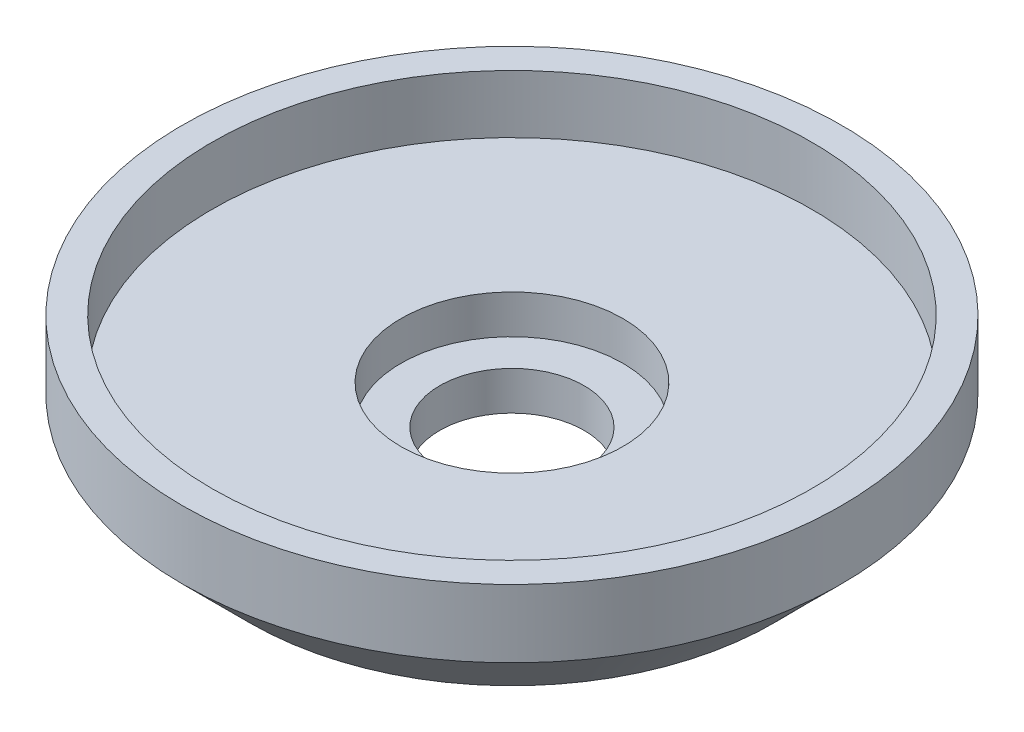
ISO-10303-21;
HEADER;
FILE_DESCRIPTION(('STEP AP214'),'2;1');
FILE_NAME('part.step','',(''),(''),'','','');
FILE_SCHEMA(('AUTOMOTIVE_DESIGN { 1 0 10303 214 1 1 1 1 }'));
ENDSEC;
DATA;
#1=APPLICATION_CONTEXT('core data for automotive mechanical design processes');
#2=APPLICATION_PROTOCOL_DEFINITION('international standard','automotive_design',2000,#1);
#3=PRODUCT_CONTEXT('',#1,'mechanical');
#4=PRODUCT('Part','Part','',(#3));
#5=PRODUCT_RELATED_PRODUCT_CATEGORY('part','',(#4));
#6=PRODUCT_DEFINITION_FORMATION('','',#4);
#7=PRODUCT_DEFINITION_CONTEXT('part definition',#1,'design');
#8=PRODUCT_DEFINITION('design','',#6,#7);
#9=PRODUCT_DEFINITION_SHAPE('','',#8);
#10=(LENGTH_UNIT() NAMED_UNIT(*) SI_UNIT(.MILLI.,.METRE.));
#11=(NAMED_UNIT(*) PLANE_ANGLE_UNIT() SI_UNIT($,.RADIAN.));
#12=(NAMED_UNIT(*) SI_UNIT($,.STERADIAN.) SOLID_ANGLE_UNIT());
#13=UNCERTAINTY_MEASURE_WITH_UNIT(LENGTH_MEASURE(1.E-05),#10,'distance_accuracy_value','');
#14=(GEOMETRIC_REPRESENTATION_CONTEXT(3) GLOBAL_UNCERTAINTY_ASSIGNED_CONTEXT((#13)) GLOBAL_UNIT_ASSIGNED_CONTEXT((#10,
#11,#12)) REPRESENTATION_CONTEXT('',''));
#15=CARTESIAN_POINT('',(0.,0.,0.));
#16=DIRECTION('',(0.,0.,1.));
#17=DIRECTION('',(1.,0.,0.));
#18=AXIS2_PLACEMENT_3D('',#15,#16,#17);
#19=CARTESIAN_POINT('',(0.,14.,0.));
#20=DIRECTION('',(0.,-1.,0.));
#21=DIRECTION('',(0.,0.,-1.));
#22=AXIS2_PLACEMENT_3D('',#19,#20,#21);
#23=CYLINDRICAL_SURFACE('',#22,34.);
#24=CARTESIAN_POINT('',(0.,7.00000000000001,0.));
#25=DIRECTION('',(0.,1.,0.));
#26=DIRECTION('',(0.,0.,1.));
#27=AXIS2_PLACEMENT_3D('',#24,#25,#26);
#28=CIRCLE('',#27,34.);
#29=CARTESIAN_POINT('',(0.,7.00000000000001,34.));
#30=VERTEX_POINT('',#29);
#31=EDGE_CURVE('E49',#30,#30,#28,.T.);
#32=ORIENTED_EDGE('',*,*,#31,.T.);
#33=EDGE_LOOP('',(#32));
#34=FACE_BOUND('',#33,.T.);
#35=CARTESIAN_POINT('',(0.,14.,0.));
#36=DIRECTION('',(0.,1.,0.));
#37=DIRECTION('',(0.,0.,1.));
#38=AXIS2_PLACEMENT_3D('',#35,#36,#37);
#39=CIRCLE('',#38,34.);
#40=CARTESIAN_POINT('',(0.,14.,34.));
#41=VERTEX_POINT('',#40);
#42=EDGE_CURVE('E53',#41,#41,#39,.T.);
#43=ORIENTED_EDGE('',*,*,#42,.F.);
#44=EDGE_LOOP('',(#43));
#45=FACE_BOUND('',#44,.T.);
#46=ADVANCED_FACE('F41',(#34,#45),#23,.T.);
#47=CARTESIAN_POINT('',(0.,14.,0.));
#48=DIRECTION('',(0.,1.,0.));
#49=DIRECTION('',(0.,0.,1.));
#50=AXIS2_PLACEMENT_3D('',#47,#48,#49);
#51=PLANE('',#50);
#52=CARTESIAN_POINT('',(0.,14.,0.));
#53=DIRECTION('',(0.,1.,0.));
#54=DIRECTION('',(0.,0.,1.));
#55=AXIS2_PLACEMENT_3D('',#52,#53,#54);
#56=CIRCLE('',#55,30.95);
#57=CARTESIAN_POINT('',(0.,14.,30.95));
#58=VERTEX_POINT('',#57);
#59=EDGE_CURVE('E60',#58,#58,#56,.T.);
#60=ORIENTED_EDGE('',*,*,#59,.F.);
#61=EDGE_LOOP('',(#60));
#62=FACE_BOUND('',#61,.T.);
#63=ORIENTED_EDGE('',*,*,#42,.T.);
#64=EDGE_LOOP('',(#63));
#65=FACE_BOUND('',#64,.T.);
#66=ADVANCED_FACE('F110',(#62,#65),#51,.T.);
#67=CARTESIAN_POINT('',(0.,0.,0.));
#68=DIRECTION('',(0.,1.,0.));
#69=DIRECTION('',(0.,0.,1.));
#70=AXIS2_PLACEMENT_3D('',#67,#68,#69);
#71=PLANE('',#70);
#72=CARTESIAN_POINT('',(0.,0.,0.));
#73=DIRECTION('',(0.,1.,0.));
#74=DIRECTION('',(0.,0.,1.));
#75=AXIS2_PLACEMENT_3D('',#72,#73,#74);
#76=CIRCLE('',#75,27.);
#77=CARTESIAN_POINT('',(0.,0.,27.));
#78=VERTEX_POINT('',#77);
#79=EDGE_CURVE('E10',#78,#78,#76,.F.);
#80=ORIENTED_EDGE('',*,*,#79,.T.);
#81=EDGE_LOOP('',(#80));
#82=FACE_BOUND('',#81,.T.);
#83=CARTESIAN_POINT('',(0.,0.,0.));
#84=DIRECTION('',(0.,1.,0.));
#85=DIRECTION('',(0.,0.,1.));
#86=AXIS2_PLACEMENT_3D('',#83,#84,#85);
#87=CIRCLE('',#86,7.45);
#88=CARTESIAN_POINT('',(0.,0.,7.45));
#89=VERTEX_POINT('',#88);
#90=EDGE_CURVE('E69',#89,#89,#87,.T.);
#91=ORIENTED_EDGE('',*,*,#90,.T.);
#92=EDGE_LOOP('',(#91));
#93=FACE_BOUND('',#92,.T.);
#94=ADVANCED_FACE('F78',(#82,#93),#71,.F.);
#95=CARTESIAN_POINT('',(0.,8.,0.));
#96=DIRECTION('',(0.,1.,0.));
#97=DIRECTION('',(0.,0.,1.));
#98=AXIS2_PLACEMENT_3D('',#95,#96,#97);
#99=CYLINDRICAL_SURFACE('',#98,30.95);
#100=CARTESIAN_POINT('',(0.,8.,0.));
#101=DIRECTION('',(0.,1.,0.));
#102=DIRECTION('',(0.,0.,1.));
#103=AXIS2_PLACEMENT_3D('',#100,#101,#102);
#104=CIRCLE('',#103,30.95);
#105=CARTESIAN_POINT('',(0.,8.,30.95));
#106=VERTEX_POINT('',#105);
#107=EDGE_CURVE('E57',#106,#106,#104,.T.);
#108=ORIENTED_EDGE('',*,*,#107,.F.);
#109=EDGE_LOOP('',(#108));
#110=FACE_BOUND('',#109,.T.);
#111=ORIENTED_EDGE('',*,*,#59,.T.);
#112=EDGE_LOOP('',(#111));
#113=FACE_BOUND('',#112,.T.);
#114=ADVANCED_FACE('F101',(#110,#113),#99,.F.);
#115=CARTESIAN_POINT('',(0.,8.,0.));
#116=DIRECTION('',(0.,1.,0.));
#117=DIRECTION('',(0.,0.,1.));
#118=AXIS2_PLACEMENT_3D('',#115,#116,#117);
#119=PLANE('',#118);
#120=CARTESIAN_POINT('',(0.,8.,0.));
#121=DIRECTION('',(0.,1.,0.));
#122=DIRECTION('',(0.,0.,1.));
#123=AXIS2_PLACEMENT_3D('',#120,#121,#122);
#124=CIRCLE('',#123,11.45);
#125=CARTESIAN_POINT('',(0.,8.,11.45));
#126=VERTEX_POINT('',#125);
#127=EDGE_CURVE('E66',#126,#126,#124,.T.);
#128=ORIENTED_EDGE('',*,*,#127,.F.);
#129=EDGE_LOOP('',(#128));
#130=FACE_BOUND('',#129,.T.);
#131=ORIENTED_EDGE('',*,*,#107,.T.);
#132=EDGE_LOOP('',(#131));
#133=FACE_BOUND('',#132,.T.);
#134=ADVANCED_FACE('F95',(#130,#133),#119,.T.);
#135=CARTESIAN_POINT('',(0.,4.,0.));
#136=DIRECTION('',(0.,1.,0.));
#137=DIRECTION('',(0.,0.,1.));
#138=AXIS2_PLACEMENT_3D('',#135,#136,#137);
#139=CYLINDRICAL_SURFACE('',#138,11.45);
#140=CARTESIAN_POINT('',(0.,4.,0.));
#141=DIRECTION('',(0.,1.,0.));
#142=DIRECTION('',(0.,0.,1.));
#143=AXIS2_PLACEMENT_3D('',#140,#141,#142);
#144=CIRCLE('',#143,11.45);
#145=CARTESIAN_POINT('',(0.,4.,11.45));
#146=VERTEX_POINT('',#145);
#147=EDGE_CURVE('E63',#146,#146,#144,.T.);
#148=ORIENTED_EDGE('',*,*,#147,.F.);
#149=EDGE_LOOP('',(#148));
#150=FACE_BOUND('',#149,.T.);
#151=ORIENTED_EDGE('',*,*,#127,.T.);
#152=EDGE_LOOP('',(#151));
#153=FACE_BOUND('',#152,.T.);
#154=ADVANCED_FACE('F89',(#150,#153),#139,.F.);
#155=CARTESIAN_POINT('',(0.,4.,0.));
#156=DIRECTION('',(0.,1.,0.));
#157=DIRECTION('',(0.,0.,1.));
#158=AXIS2_PLACEMENT_3D('',#155,#156,#157);
#159=PLANE('',#158);
#160=CARTESIAN_POINT('',(0.,4.,0.));
#161=DIRECTION('',(0.,1.,0.));
#162=DIRECTION('',(0.,0.,1.));
#163=AXIS2_PLACEMENT_3D('',#160,#161,#162);
#164=CIRCLE('',#163,7.45);
#165=CARTESIAN_POINT('',(0.,4.,7.45));
#166=VERTEX_POINT('',#165);
#167=EDGE_CURVE('E72',#166,#166,#164,.T.);
#168=ORIENTED_EDGE('',*,*,#167,.F.);
#169=EDGE_LOOP('',(#168));
#170=FACE_BOUND('',#169,.T.);
#171=ORIENTED_EDGE('',*,*,#147,.T.);
#172=EDGE_LOOP('',(#171));
#173=FACE_BOUND('',#172,.T.);
#174=ADVANCED_FACE('F83',(#170,#173),#159,.T.);
#175=CARTESIAN_POINT('',(0.,0.,0.));
#176=DIRECTION('',(0.,1.,0.));
#177=DIRECTION('',(0.,0.,1.));
#178=AXIS2_PLACEMENT_3D('',#175,#176,#177);
#179=CYLINDRICAL_SURFACE('',#178,7.45);
#180=ORIENTED_EDGE('',*,*,#90,.F.);
#181=EDGE_LOOP('',(#180));
#182=FACE_BOUND('',#181,.T.);
#183=ORIENTED_EDGE('',*,*,#167,.T.);
#184=EDGE_LOOP('',(#183));
#185=FACE_BOUND('',#184,.T.);
#186=ADVANCED_FACE('F80',(#182,#185),#179,.F.);
#187=CARTESIAN_POINT('',(0.,7.00000000000001,0.));
#188=DIRECTION('',(0.,1.,0.));
#189=DIRECTION('',(0.,0.,1.));
#190=AXIS2_PLACEMENT_3D('',#187,#188,#189);
#191=CONICAL_SURFACE('',#190,34.,0.78539816339745);
#192=CARTESIAN_POINT('',(0.,0.,27.));
#193=CARTESIAN_POINT('',(0.,0.0729166666666658,27.0729166666666));
#194=CARTESIAN_POINT('',(0.,0.145833333333333,27.1458333333333));
#195=CARTESIAN_POINT('',(0.,0.291666666666666,27.2916666666666));
#196=CARTESIAN_POINT('',(0.,0.364583333333333,27.3645833333333));
#197=CARTESIAN_POINT('',(0.,0.510416666666666,27.5104166666666));
#198=CARTESIAN_POINT('',(0.,0.583333333333333,27.5833333333333));
#199=CARTESIAN_POINT('',(0.,0.729166666666667,27.7291666666666));
#200=CARTESIAN_POINT('',(0.,0.802083333333334,27.8020833333333));
#201=CARTESIAN_POINT('',(0.,0.947916666666667,27.9479166666666));
#202=CARTESIAN_POINT('',(0.,1.02083333333333,28.0208333333333));
#203=CARTESIAN_POINT('',(0.,1.16666666666667,28.1666666666666));
#204=CARTESIAN_POINT('',(0.,1.23958333333333,28.2395833333333));
#205=CARTESIAN_POINT('',(0.,1.38541666666667,28.3854166666666));
#206=CARTESIAN_POINT('',(0.,1.45833333333333,28.4583333333333));
#207=CARTESIAN_POINT('',(0.,1.60416666666667,28.6041666666666));
#208=CARTESIAN_POINT('',(0.,1.67708333333333,28.6770833333333));
#209=CARTESIAN_POINT('',(0.,1.82291666666667,28.8229166666666));
#210=CARTESIAN_POINT('',(0.,1.89583333333333,28.8958333333333));
#211=CARTESIAN_POINT('',(0.,2.04166666666667,29.0416666666666));
#212=CARTESIAN_POINT('',(0.,2.11458333333333,29.1145833333333));
#213=CARTESIAN_POINT('',(0.,2.26041666666667,29.2604166666666));
#214=CARTESIAN_POINT('',(0.,2.33333333333333,29.3333333333333));
#215=CARTESIAN_POINT('',(0.,2.47916666666667,29.4791666666666));
#216=CARTESIAN_POINT('',(0.,2.55208333333333,29.5520833333333));
#217=CARTESIAN_POINT('',(0.,2.69791666666667,29.6979166666666));
#218=CARTESIAN_POINT('',(0.,2.77083333333334,29.7708333333333));
#219=CARTESIAN_POINT('',(0.,2.91666666666667,29.9166666666666));
#220=CARTESIAN_POINT('',(0.,2.98958333333334,29.9895833333333));
#221=CARTESIAN_POINT('',(0.,3.13541666666667,30.1354166666666));
#222=CARTESIAN_POINT('',(0.,3.20833333333334,30.2083333333333));
#223=CARTESIAN_POINT('',(0.,3.35416666666667,30.3541666666667));
#224=CARTESIAN_POINT('',(0.,3.42708333333334,30.4270833333333));
#225=CARTESIAN_POINT('',(0.,3.57291666666667,30.5729166666667));
#226=CARTESIAN_POINT('',(0.,3.64583333333334,30.6458333333333));
#227=CARTESIAN_POINT('',(0.,3.79166666666667,30.7916666666667));
#228=CARTESIAN_POINT('',(0.,3.86458333333334,30.8645833333333));
#229=CARTESIAN_POINT('',(0.,4.01041666666667,31.0104166666667));
#230=CARTESIAN_POINT('',(0.,4.08333333333334,31.0833333333333));
#231=CARTESIAN_POINT('',(0.,4.22916666666667,31.2291666666667));
#232=CARTESIAN_POINT('',(0.,4.30208333333334,31.3020833333333));
#233=CARTESIAN_POINT('',(0.,4.44791666666667,31.4479166666667));
#234=CARTESIAN_POINT('',(0.,4.52083333333334,31.5208333333333));
#235=CARTESIAN_POINT('',(0.,4.66666666666667,31.6666666666667));
#236=CARTESIAN_POINT('',(0.,4.73958333333334,31.7395833333333));
#237=CARTESIAN_POINT('',(0.,4.88541666666667,31.8854166666667));
#238=CARTESIAN_POINT('',(0.,4.95833333333334,31.9583333333333));
#239=CARTESIAN_POINT('',(0.,5.10416666666667,32.1041666666667));
#240=CARTESIAN_POINT('',(0.,5.17708333333334,32.1770833333333));
#241=CARTESIAN_POINT('',(0.,5.32291666666667,32.3229166666667));
#242=CARTESIAN_POINT('',(0.,5.39583333333334,32.3958333333333));
#243=CARTESIAN_POINT('',(0.,5.54166666666667,32.5416666666667));
#244=CARTESIAN_POINT('',(0.,5.61458333333334,32.6145833333333));
#245=CARTESIAN_POINT('',(0.,5.76041666666667,32.7604166666667));
#246=CARTESIAN_POINT('',(0.,5.83333333333334,32.8333333333333));
#247=CARTESIAN_POINT('',(0.,5.97916666666667,32.9791666666667));
#248=CARTESIAN_POINT('',(0.,6.05208333333334,33.0520833333333));
#249=CARTESIAN_POINT('',(0.,6.19791666666667,33.1979166666667));
#250=CARTESIAN_POINT('',(0.,6.27083333333334,33.2708333333333));
#251=CARTESIAN_POINT('',(0.,6.41666666666667,33.4166666666667));
#252=CARTESIAN_POINT('',(0.,6.48958333333334,33.4895833333333));
#253=CARTESIAN_POINT('',(0.,6.63541666666667,33.6354166666667));
#254=CARTESIAN_POINT('',(0.,6.70833333333334,33.7083333333333));
#255=CARTESIAN_POINT('',(0.,6.85416666666667,33.8541666666667));
#256=CARTESIAN_POINT('',(0.,6.92708333333334,33.9270833333333));
#257=CARTESIAN_POINT('',(0.,7.00000000000001,34.));
#258=B_SPLINE_CURVE_WITH_KNOTS('',3,(#192,#193,#194,#195,#196,#197,#198,#199,#200,#201,#202,
#203,#204,#205,#206,#207,#208,#209,#210,#211,#212,#213,#214,#215,#216,#217,#218,#219,#220,#221,
#222,#223,#224,#225,#226,#227,#228,#229,#230,#231,#232,#233,#234,#235,#236,#237,#238,#239,#240,
#241,#242,#243,#244,#245,#246,#247,#248,#249,#250,#251,#252,#253,#254,#255,#256,#257),
.UNSPECIFIED.,.F.,.F.,(4,2,2,2,2,2,2,2,2,2,2,2,2,2,2,2,2,2,2,2,2,2,2,2,2,2,2,2,2,2,2,2,4),(0.,
0.309359216769115,0.61871843353823,0.928077650307344,1.23743686707646,1.54679608384558,
1.85615530061469,2.16551451738381,2.47487373415292,2.78423295092204,3.09359216769115,
3.40295138446027,3.71231060122939,4.0216698179985,4.33102903476762,4.64038825153673,
4.94974746830585,5.25910668507496,5.56846590184408,5.87782511861319,6.18718433538231,
6.49654355215142,6.80590276892054,7.11526198568965,7.42462120245877,7.73398041922789,
8.043339635997,8.35269885276612,8.66205806953523,8.97141728630435,9.28077650307346,
9.59013571984257,9.89949493661169),.UNSPECIFIED.);
#259=EDGE_CURVE('BSEAM44',#78,#30,#258,.T.);
#260=ORIENTED_EDGE('',*,*,#79,.F.);
#261=ORIENTED_EDGE('',*,*,#31,.F.);
#262=ORIENTED_EDGE('',*,*,#259,.T.);
#263=ORIENTED_EDGE('',*,*,#259,.F.);
#264=EDGE_LOOP('',(#260,#262,#261,#263));
#265=FACE_BOUND('',#264,.T.);
#266=ADVANCED_FACE('F44',(#265),#191,.T.);
#267=CLOSED_SHELL('',(#46,#66,#94,#114,#134,#154,#174,#186,#266));
#268=MANIFOLD_SOLID_BREP('B2',#267);
#269=ADVANCED_BREP_SHAPE_REPRESENTATION('',(#18,#268),#14);
#270=SHAPE_DEFINITION_REPRESENTATION(#9,#269);
ENDSEC;
END-ISO-10303-21;
